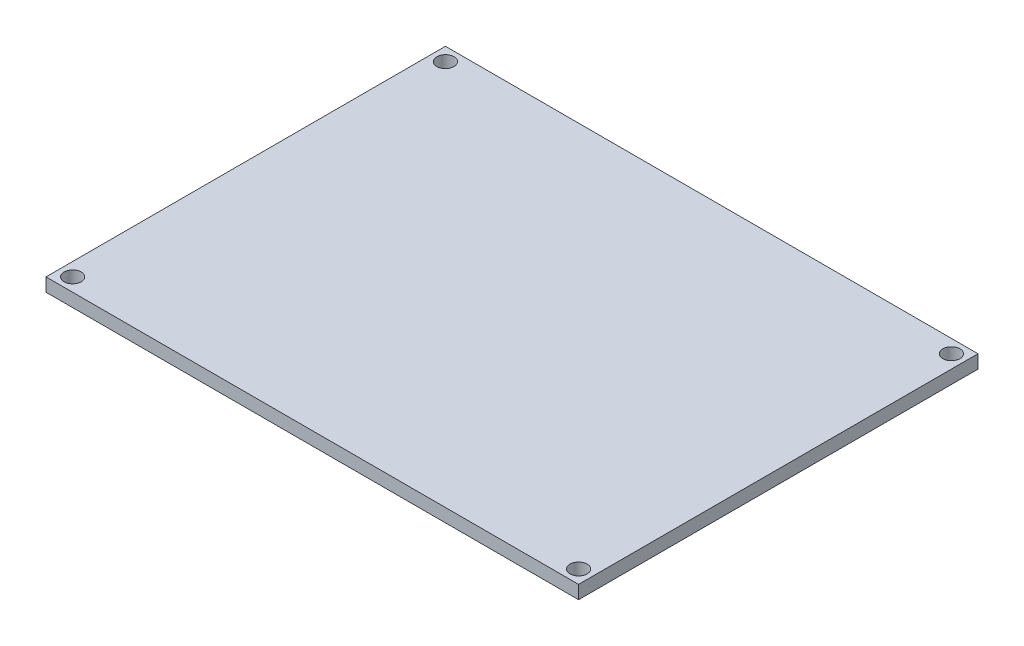
ISO-10303-21;
HEADER;
FILE_DESCRIPTION(('STEP AP214'),'2;1');
FILE_NAME('part.step','',(''),(''),'','','');
FILE_SCHEMA(('AUTOMOTIVE_DESIGN { 1 0 10303 214 1 1 1 1 }'));
ENDSEC;
DATA;
#1=APPLICATION_CONTEXT('core data for automotive mechanical design processes');
#2=APPLICATION_PROTOCOL_DEFINITION('international standard','automotive_design',2000,#1);
#3=PRODUCT_CONTEXT('',#1,'mechanical');
#4=PRODUCT('Part','Part','',(#3));
#5=PRODUCT_RELATED_PRODUCT_CATEGORY('part','',(#4));
#6=PRODUCT_DEFINITION_FORMATION('','',#4);
#7=PRODUCT_DEFINITION_CONTEXT('part definition',#1,'design');
#8=PRODUCT_DEFINITION('design','',#6,#7);
#9=PRODUCT_DEFINITION_SHAPE('','',#8);
#10=(LENGTH_UNIT() NAMED_UNIT(*) SI_UNIT(.MILLI.,.METRE.));
#11=(NAMED_UNIT(*) PLANE_ANGLE_UNIT() SI_UNIT($,.RADIAN.));
#12=(NAMED_UNIT(*) SI_UNIT($,.STERADIAN.) SOLID_ANGLE_UNIT());
#13=UNCERTAINTY_MEASURE_WITH_UNIT(LENGTH_MEASURE(1.E-05),#10,'distance_accuracy_value','');
#14=(GEOMETRIC_REPRESENTATION_CONTEXT(3) GLOBAL_UNCERTAINTY_ASSIGNED_CONTEXT((#13)) GLOBAL_UNIT_ASSIGNED_CONTEXT((#10,
#11,#12)) REPRESENTATION_CONTEXT('',''));
#15=CARTESIAN_POINT('',(0.,0.,0.));
#16=DIRECTION('',(0.,0.,1.));
#17=DIRECTION('',(1.,0.,0.));
#18=AXIS2_PLACEMENT_3D('',#15,#16,#17);
#19=CARTESIAN_POINT('',(0.,2.54,0.));
#20=DIRECTION('',(1.,0.,0.));
#21=DIRECTION('',(0.,0.,-1.));
#22=AXIS2_PLACEMENT_3D('',#19,#20,#21);
#23=PLANE('',#22);
#24=DIRECTION('',(0.,0.,1.));
#25=VECTOR('',#24,1.);
#26=CARTESIAN_POINT('',(0.,0.,0.));
#27=LINE('',#26,#25);
#28=CARTESIAN_POINT('',(0.,0.,-76.2));
#29=VERTEX_POINT('',#28);
#30=CARTESIAN_POINT('',(0.,0.,0.));
#31=VERTEX_POINT('',#30);
#32=EDGE_CURVE('E96',#29,#31,#27,.T.);
#33=ORIENTED_EDGE('',*,*,#32,.T.);
#34=DIRECTION('',(0.,-1.,0.));
#35=VECTOR('',#34,1.);
#36=CARTESIAN_POINT('',(0.,2.54,0.));
#37=LINE('',#36,#35);
#38=CARTESIAN_POINT('',(0.,2.54,0.));
#39=VERTEX_POINT('',#38);
#40=EDGE_CURVE('E11',#39,#31,#37,.T.);
#41=ORIENTED_EDGE('',*,*,#40,.F.);
#42=DIRECTION('',(0.,0.,1.));
#43=VECTOR('',#42,1.);
#44=CARTESIAN_POINT('',(0.,2.54,0.));
#45=LINE('',#44,#43);
#46=CARTESIAN_POINT('',(0.,2.54,-76.2));
#47=VERTEX_POINT('',#46);
#48=EDGE_CURVE('E84',#47,#39,#45,.T.);
#49=ORIENTED_EDGE('',*,*,#48,.F.);
#50=DIRECTION('',(0.,-1.,0.));
#51=VECTOR('',#50,1.);
#52=CARTESIAN_POINT('',(0.,2.54,-76.2));
#53=LINE('',#52,#51);
#54=EDGE_CURVE('E92',#47,#29,#53,.T.);
#55=ORIENTED_EDGE('',*,*,#54,.T.);
#56=EDGE_LOOP('',(#33,#41,#49,#55));
#57=FACE_BOUND('',#56,.T.);
#58=ADVANCED_FACE('F33',(#57),#23,.F.);
#59=CARTESIAN_POINT('',(0.,2.54,0.));
#60=DIRECTION('',(0.,0.,-1.));
#61=DIRECTION('',(-1.,0.,0.));
#62=AXIS2_PLACEMENT_3D('',#59,#60,#61);
#63=PLANE('',#62);
#64=DIRECTION('',(1.,0.,0.));
#65=VECTOR('',#64,1.);
#66=CARTESIAN_POINT('',(0.,0.,0.));
#67=LINE('',#66,#65);
#68=CARTESIAN_POINT('',(101.6,0.,0.));
#69=VERTEX_POINT('',#68);
#70=EDGE_CURVE('E88',#31,#69,#67,.T.);
#71=ORIENTED_EDGE('',*,*,#70,.T.);
#72=DIRECTION('',(0.,-1.,0.));
#73=VECTOR('',#72,1.);
#74=CARTESIAN_POINT('',(101.6,2.54,0.));
#75=LINE('',#74,#73);
#76=CARTESIAN_POINT('',(101.6,2.54,0.));
#77=VERTEX_POINT('',#76);
#78=EDGE_CURVE('E41',#77,#69,#75,.T.);
#79=ORIENTED_EDGE('',*,*,#78,.F.);
#80=DIRECTION('',(1.,0.,0.));
#81=VECTOR('',#80,1.);
#82=CARTESIAN_POINT('',(0.,2.54,0.));
#83=LINE('',#82,#81);
#84=EDGE_CURVE('E79',#39,#77,#83,.T.);
#85=ORIENTED_EDGE('',*,*,#84,.F.);
#86=ORIENTED_EDGE('',*,*,#40,.T.);
#87=EDGE_LOOP('',(#71,#79,#85,#86));
#88=FACE_BOUND('',#87,.T.);
#89=ADVANCED_FACE('F87',(#88),#63,.F.);
#90=CARTESIAN_POINT('',(101.6,2.54,0.));
#91=DIRECTION('',(-1.,0.,0.));
#92=DIRECTION('',(0.,0.,1.));
#93=AXIS2_PLACEMENT_3D('',#90,#91,#92);
#94=PLANE('',#93);
#95=DIRECTION('',(0.,0.,-1.));
#96=VECTOR('',#95,1.);
#97=CARTESIAN_POINT('',(101.6,0.,0.));
#98=LINE('',#97,#96);
#99=CARTESIAN_POINT('',(101.6,0.,-76.2));
#100=VERTEX_POINT('',#99);
#101=EDGE_CURVE('E66',#69,#100,#98,.T.);
#102=ORIENTED_EDGE('',*,*,#101,.T.);
#103=DIRECTION('',(0.,-1.,0.));
#104=VECTOR('',#103,1.);
#105=CARTESIAN_POINT('',(101.6,2.54,-76.2));
#106=LINE('',#105,#104);
#107=CARTESIAN_POINT('',(101.6,2.54,-76.2));
#108=VERTEX_POINT('',#107);
#109=EDGE_CURVE('E89',#108,#100,#106,.T.);
#110=ORIENTED_EDGE('',*,*,#109,.F.);
#111=DIRECTION('',(0.,0.,-1.));
#112=VECTOR('',#111,1.);
#113=CARTESIAN_POINT('',(101.6,2.54,0.));
#114=LINE('',#113,#112);
#115=EDGE_CURVE('E82',#77,#108,#114,.T.);
#116=ORIENTED_EDGE('',*,*,#115,.F.);
#117=ORIENTED_EDGE('',*,*,#78,.T.);
#118=EDGE_LOOP('',(#102,#110,#116,#117));
#119=FACE_BOUND('',#118,.T.);
#120=ADVANCED_FACE('F90',(#119),#94,.F.);
#121=CARTESIAN_POINT('',(0.,2.54,-76.2));
#122=DIRECTION('',(0.,0.,1.));
#123=DIRECTION('',(1.,0.,0.));
#124=AXIS2_PLACEMENT_3D('',#121,#122,#123);
#125=PLANE('',#124);
#126=DIRECTION('',(-1.,0.,0.));
#127=VECTOR('',#126,1.);
#128=CARTESIAN_POINT('',(0.,0.,-76.2));
#129=LINE('',#128,#127);
#130=EDGE_CURVE('E72',#100,#29,#129,.T.);
#131=ORIENTED_EDGE('',*,*,#130,.T.);
#132=ORIENTED_EDGE('',*,*,#54,.F.);
#133=DIRECTION('',(-1.,0.,0.));
#134=VECTOR('',#133,1.);
#135=CARTESIAN_POINT('',(0.,2.54,-76.2));
#136=LINE('',#135,#134);
#137=EDGE_CURVE('E49',#108,#47,#136,.T.);
#138=ORIENTED_EDGE('',*,*,#137,.F.);
#139=ORIENTED_EDGE('',*,*,#109,.T.);
#140=EDGE_LOOP('',(#131,#132,#138,#139));
#141=FACE_BOUND('',#140,.T.);
#142=ADVANCED_FACE('F104',(#141),#125,.F.);
#143=CARTESIAN_POINT('',(0.,2.54,0.));
#144=DIRECTION('',(0.,-1.,0.));
#145=DIRECTION('',(0.,0.,-1.));
#146=AXIS2_PLACEMENT_3D('',#143,#144,#145);
#147=PLANE('',#146);
#148=CARTESIAN_POINT('',(2.54,2.54,-73.66));
#149=DIRECTION('',(0.,1.,0.));
#150=DIRECTION('',(0.,0.,1.));
#151=AXIS2_PLACEMENT_3D('',#148,#149,#150);
#152=CIRCLE('',#151,1.63194999999999);
#153=CARTESIAN_POINT('',(2.54,2.54,-72.02805));
#154=VERTEX_POINT('',#153);
#155=EDGE_CURVE('E130',#154,#154,#152,.T.);
#156=ORIENTED_EDGE('',*,*,#155,.F.);
#157=EDGE_LOOP('',(#156));
#158=FACE_BOUND('',#157,.T.);
#159=CARTESIAN_POINT('',(2.54,2.54,-2.54));
#160=DIRECTION('',(0.,1.,0.));
#161=DIRECTION('',(0.,0.,1.));
#162=AXIS2_PLACEMENT_3D('',#159,#160,#161);
#163=CIRCLE('',#162,1.63194999999999);
#164=CARTESIAN_POINT('',(2.54,2.54,-0.908050000000011));
#165=VERTEX_POINT('',#164);
#166=EDGE_CURVE('E124',#165,#165,#163,.T.);
#167=ORIENTED_EDGE('',*,*,#166,.F.);
#168=EDGE_LOOP('',(#167));
#169=FACE_BOUND('',#168,.T.);
#170=CARTESIAN_POINT('',(99.06,2.54,-73.66));
#171=DIRECTION('',(0.,1.,0.));
#172=DIRECTION('',(0.,0.,1.));
#173=AXIS2_PLACEMENT_3D('',#170,#171,#172);
#174=CIRCLE('',#173,1.63194999999999);
#175=CARTESIAN_POINT('',(99.06,2.54,-72.02805));
#176=VERTEX_POINT('',#175);
#177=EDGE_CURVE('E118',#176,#176,#174,.T.);
#178=ORIENTED_EDGE('',*,*,#177,.F.);
#179=EDGE_LOOP('',(#178));
#180=FACE_BOUND('',#179,.T.);
#181=CARTESIAN_POINT('',(99.06,2.54,-2.54));
#182=DIRECTION('',(0.,1.,0.));
#183=DIRECTION('',(0.,0.,1.));
#184=AXIS2_PLACEMENT_3D('',#181,#182,#183);
#185=CIRCLE('',#184,1.63194999999999);
#186=CARTESIAN_POINT('',(99.06,2.54,-0.908050000000007));
#187=VERTEX_POINT('',#186);
#188=EDGE_CURVE('E112',#187,#187,#185,.T.);
#189=ORIENTED_EDGE('',*,*,#188,.F.);
#190=EDGE_LOOP('',(#189));
#191=FACE_BOUND('',#190,.T.);
#192=ORIENTED_EDGE('',*,*,#48,.T.);
#193=ORIENTED_EDGE('',*,*,#84,.T.);
#194=ORIENTED_EDGE('',*,*,#115,.T.);
#195=ORIENTED_EDGE('',*,*,#137,.T.);
#196=EDGE_LOOP('',(#192,#193,#194,#195));
#197=FACE_BOUND('',#196,.T.);
#198=ADVANCED_FACE('F80',(#158,#169,#180,#191,#197),#147,.F.);
#199=CARTESIAN_POINT('',(0.,0.,0.));
#200=DIRECTION('',(0.,-1.,0.));
#201=DIRECTION('',(0.,0.,-1.));
#202=AXIS2_PLACEMENT_3D('',#199,#200,#201);
#203=PLANE('',#202);
#204=CARTESIAN_POINT('',(2.54,0.,-73.66));
#205=DIRECTION('',(0.,-1.,0.));
#206=DIRECTION('',(0.,0.,-1.));
#207=AXIS2_PLACEMENT_3D('',#204,#205,#206);
#208=CIRCLE('',#207,1.63194999999999);
#209=CARTESIAN_POINT('',(2.54,0.,-75.29195));
#210=VERTEX_POINT('',#209);
#211=EDGE_CURVE('E127',#210,#210,#208,.T.);
#212=ORIENTED_EDGE('',*,*,#211,.F.);
#213=EDGE_LOOP('',(#212));
#214=FACE_BOUND('',#213,.T.);
#215=CARTESIAN_POINT('',(2.54,0.,-2.54));
#216=DIRECTION('',(0.,-1.,0.));
#217=DIRECTION('',(0.,0.,-1.));
#218=AXIS2_PLACEMENT_3D('',#215,#216,#217);
#219=CIRCLE('',#218,1.63194999999999);
#220=CARTESIAN_POINT('',(2.54,0.,-4.17194999999999));
#221=VERTEX_POINT('',#220);
#222=EDGE_CURVE('E121',#221,#221,#219,.T.);
#223=ORIENTED_EDGE('',*,*,#222,.F.);
#224=EDGE_LOOP('',(#223));
#225=FACE_BOUND('',#224,.T.);
#226=CARTESIAN_POINT('',(99.06,0.,-73.66));
#227=DIRECTION('',(0.,-1.,0.));
#228=DIRECTION('',(0.,0.,-1.));
#229=AXIS2_PLACEMENT_3D('',#226,#227,#228);
#230=CIRCLE('',#229,1.63194999999999);
#231=CARTESIAN_POINT('',(99.06,0.,-75.29195));
#232=VERTEX_POINT('',#231);
#233=EDGE_CURVE('E115',#232,#232,#230,.T.);
#234=ORIENTED_EDGE('',*,*,#233,.F.);
#235=EDGE_LOOP('',(#234));
#236=FACE_BOUND('',#235,.T.);
#237=CARTESIAN_POINT('',(99.06,0.,-2.54));
#238=DIRECTION('',(0.,-1.,0.));
#239=DIRECTION('',(0.,0.,-1.));
#240=AXIS2_PLACEMENT_3D('',#237,#238,#239);
#241=CIRCLE('',#240,1.63194999999999);
#242=CARTESIAN_POINT('',(99.06,0.,-4.17194999999999));
#243=VERTEX_POINT('',#242);
#244=EDGE_CURVE('E99',#243,#243,#241,.T.);
#245=ORIENTED_EDGE('',*,*,#244,.F.);
#246=EDGE_LOOP('',(#245));
#247=FACE_BOUND('',#246,.T.);
#248=ORIENTED_EDGE('',*,*,#32,.F.);
#249=ORIENTED_EDGE('',*,*,#130,.F.);
#250=ORIENTED_EDGE('',*,*,#101,.F.);
#251=ORIENTED_EDGE('',*,*,#70,.F.);
#252=EDGE_LOOP('',(#248,#249,#250,#251));
#253=FACE_BOUND('',#252,.T.);
#254=ADVANCED_FACE('F107',(#214,#225,#236,#247,#253),#203,.T.);
#255=CARTESIAN_POINT('',(99.06,2.54,-2.54));
#256=DIRECTION('',(0.,1.,0.));
#257=DIRECTION('',(0.,0.,1.));
#258=AXIS2_PLACEMENT_3D('',#255,#256,#257);
#259=CYLINDRICAL_SURFACE('',#258,1.63194999999999);
#260=ORIENTED_EDGE('',*,*,#244,.T.);
#261=EDGE_LOOP('',(#260));
#262=FACE_BOUND('',#261,.T.);
#263=ORIENTED_EDGE('',*,*,#188,.T.);
#264=EDGE_LOOP('',(#263));
#265=FACE_BOUND('',#264,.T.);
#266=ADVANCED_FACE('F145',(#262,#265),#259,.F.);
#267=CARTESIAN_POINT('',(99.06,2.54,-73.66));
#268=DIRECTION('',(0.,1.,0.));
#269=DIRECTION('',(0.,0.,1.));
#270=AXIS2_PLACEMENT_3D('',#267,#268,#269);
#271=CYLINDRICAL_SURFACE('',#270,1.63194999999999);
#272=ORIENTED_EDGE('',*,*,#233,.T.);
#273=EDGE_LOOP('',(#272));
#274=FACE_BOUND('',#273,.T.);
#275=ORIENTED_EDGE('',*,*,#177,.T.);
#276=EDGE_LOOP('',(#275));
#277=FACE_BOUND('',#276,.T.);
#278=ADVANCED_FACE('F147',(#274,#277),#271,.F.);
#279=CARTESIAN_POINT('',(2.54,2.54,-2.54));
#280=DIRECTION('',(0.,1.,0.));
#281=DIRECTION('',(0.,0.,1.));
#282=AXIS2_PLACEMENT_3D('',#279,#280,#281);
#283=CYLINDRICAL_SURFACE('',#282,1.63194999999999);
#284=ORIENTED_EDGE('',*,*,#222,.T.);
#285=EDGE_LOOP('',(#284));
#286=FACE_BOUND('',#285,.T.);
#287=ORIENTED_EDGE('',*,*,#166,.T.);
#288=EDGE_LOOP('',(#287));
#289=FACE_BOUND('',#288,.T.);
#290=ADVANCED_FACE('F154',(#286,#289),#283,.F.);
#291=CARTESIAN_POINT('',(2.54,2.54,-73.66));
#292=DIRECTION('',(0.,1.,0.));
#293=DIRECTION('',(0.,0.,1.));
#294=AXIS2_PLACEMENT_3D('',#291,#292,#293);
#295=CYLINDRICAL_SURFACE('',#294,1.63194999999999);
#296=ORIENTED_EDGE('',*,*,#211,.T.);
#297=EDGE_LOOP('',(#296));
#298=FACE_BOUND('',#297,.T.);
#299=ORIENTED_EDGE('',*,*,#155,.T.);
#300=EDGE_LOOP('',(#299));
#301=FACE_BOUND('',#300,.T.);
#302=ADVANCED_FACE('F134',(#298,#301),#295,.F.);
#303=CLOSED_SHELL('',(#58,#89,#120,#142,#198,#254,#266,#278,#290,#302));
#304=MANIFOLD_SOLID_BREP('B2',#303);
#305=ADVANCED_BREP_SHAPE_REPRESENTATION('',(#18,#304),#14);
#306=SHAPE_DEFINITION_REPRESENTATION(#9,#305);
ENDSEC;
END-ISO-10303-21;
